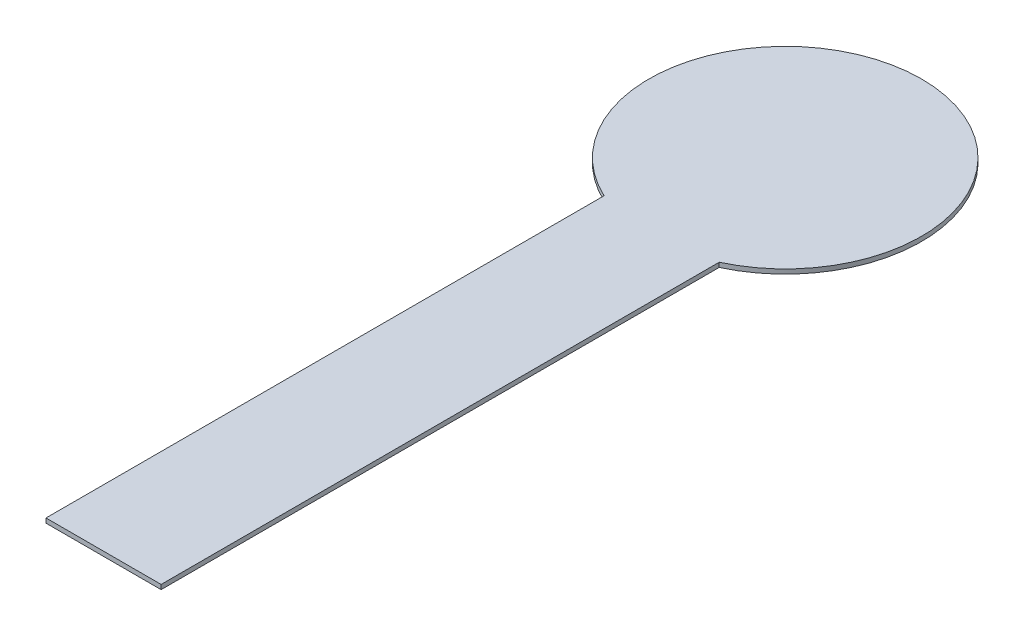
ISO-10303-21;
HEADER;
FILE_DESCRIPTION(('STEP AP214'),'2;1');
FILE_NAME('part.step','',(''),(''),'','','');
FILE_SCHEMA(('AUTOMOTIVE_DESIGN { 1 0 10303 214 1 1 1 1 }'));
ENDSEC;
DATA;
#1=APPLICATION_CONTEXT('core data for automotive mechanical design processes');
#2=APPLICATION_PROTOCOL_DEFINITION('international standard','automotive_design',2000,#1);
#3=PRODUCT_CONTEXT('',#1,'mechanical');
#4=PRODUCT('Part','Part','',(#3));
#5=PRODUCT_RELATED_PRODUCT_CATEGORY('part','',(#4));
#6=PRODUCT_DEFINITION_FORMATION('','',#4);
#7=PRODUCT_DEFINITION_CONTEXT('part definition',#1,'design');
#8=PRODUCT_DEFINITION('design','',#6,#7);
#9=PRODUCT_DEFINITION_SHAPE('','',#8);
#10=(LENGTH_UNIT() NAMED_UNIT(*) SI_UNIT(.MILLI.,.METRE.));
#11=(NAMED_UNIT(*) PLANE_ANGLE_UNIT() SI_UNIT($,.RADIAN.));
#12=(NAMED_UNIT(*) SI_UNIT($,.STERADIAN.) SOLID_ANGLE_UNIT());
#13=UNCERTAINTY_MEASURE_WITH_UNIT(LENGTH_MEASURE(1.E-05),#10,'distance_accuracy_value','');
#14=(GEOMETRIC_REPRESENTATION_CONTEXT(3) GLOBAL_UNCERTAINTY_ASSIGNED_CONTEXT((#13)) GLOBAL_UNIT_ASSIGNED_CONTEXT((#10,
#11,#12)) REPRESENTATION_CONTEXT('',''));
#15=CARTESIAN_POINT('',(0.,0.,0.));
#16=DIRECTION('',(0.,0.,1.));
#17=DIRECTION('',(1.,0.,0.));
#18=AXIS2_PLACEMENT_3D('',#15,#16,#17);
#19=CARTESIAN_POINT('',(3.8,-0.3,8.15843122174845));
#20=DIRECTION('',(-1.,0.,0.));
#21=DIRECTION('',(0.,0.,1.));
#22=AXIS2_PLACEMENT_3D('',#19,#20,#21);
#23=PLANE('',#22);
#24=DIRECTION('',(0.,0.,1.));
#25=VECTOR('',#24,1.);
#26=CARTESIAN_POINT('',(3.8,0.,8.15843122174845));
#27=LINE('',#26,#25);
#28=CARTESIAN_POINT('',(3.8,0.,8.15843122174845));
#29=VERTEX_POINT('',#28);
#30=CARTESIAN_POINT('',(3.8,0.,45.));
#31=VERTEX_POINT('',#30);
#32=EDGE_CURVE('E115',#29,#31,#27,.T.);
#33=ORIENTED_EDGE('',*,*,#32,.T.);
#34=DIRECTION('',(0.,1.,0.));
#35=VECTOR('',#34,1.);
#36=CARTESIAN_POINT('',(3.8,-0.3,45.));
#37=LINE('',#36,#35);
#38=CARTESIAN_POINT('',(3.8,-0.3,45.));
#39=VERTEX_POINT('',#38);
#40=EDGE_CURVE('E11',#39,#31,#37,.T.);
#41=ORIENTED_EDGE('',*,*,#40,.F.);
#42=DIRECTION('',(0.,0.,1.));
#43=VECTOR('',#42,1.);
#44=CARTESIAN_POINT('',(3.8,-0.3,8.15843122174845));
#45=LINE('',#44,#43);
#46=CARTESIAN_POINT('',(3.8,-0.3,8.15843122174845));
#47=VERTEX_POINT('',#46);
#48=EDGE_CURVE('E88',#47,#39,#45,.T.);
#49=ORIENTED_EDGE('',*,*,#48,.F.);
#50=DIRECTION('',(0.,1.,0.));
#51=VECTOR('',#50,1.);
#52=CARTESIAN_POINT('',(3.8,-0.3,8.15843122174845));
#53=LINE('',#52,#51);
#54=EDGE_CURVE('E64',#47,#29,#53,.T.);
#55=ORIENTED_EDGE('',*,*,#54,.T.);
#56=EDGE_LOOP('',(#33,#41,#49,#55));
#57=FACE_BOUND('',#56,.T.);
#58=ADVANCED_FACE('F47',(#57),#23,.F.);
#59=CARTESIAN_POINT('',(-3.8,-0.3,45.));
#60=DIRECTION('',(0.,0.,1.));
#61=DIRECTION('',(1.,0.,0.));
#62=AXIS2_PLACEMENT_3D('',#59,#60,#61);
#63=PLANE('',#62);
#64=DIRECTION('',(1.,0.,0.));
#65=VECTOR('',#64,1.);
#66=CARTESIAN_POINT('',(-3.8,0.,45.));
#67=LINE('',#66,#65);
#68=CARTESIAN_POINT('',(-3.8,0.,45.));
#69=VERTEX_POINT('',#68);
#70=EDGE_CURVE('E97',#69,#31,#67,.T.);
#71=ORIENTED_EDGE('',*,*,#70,.F.);
#72=DIRECTION('',(0.,1.,0.));
#73=VECTOR('',#72,1.);
#74=CARTESIAN_POINT('',(-3.8,-0.3,45.));
#75=LINE('',#74,#73);
#76=CARTESIAN_POINT('',(-3.8,-0.3,45.));
#77=VERTEX_POINT('',#76);
#78=EDGE_CURVE('E56',#77,#69,#75,.T.);
#79=ORIENTED_EDGE('',*,*,#78,.F.);
#80=DIRECTION('',(1.,0.,0.));
#81=VECTOR('',#80,1.);
#82=CARTESIAN_POINT('',(-3.8,-0.3,45.));
#83=LINE('',#82,#81);
#84=EDGE_CURVE('E95',#77,#39,#83,.T.);
#85=ORIENTED_EDGE('',*,*,#84,.T.);
#86=ORIENTED_EDGE('',*,*,#40,.T.);
#87=EDGE_LOOP('',(#71,#79,#85,#86));
#88=FACE_BOUND('',#87,.T.);
#89=ADVANCED_FACE('F94',(#88),#63,.T.);
#90=CARTESIAN_POINT('',(-3.8,-0.3,8.15843122174845));
#91=DIRECTION('',(-1.,0.,0.));
#92=DIRECTION('',(0.,0.,1.));
#93=AXIS2_PLACEMENT_3D('',#90,#91,#92);
#94=PLANE('',#93);
#95=DIRECTION('',(0.,0.,1.));
#96=VECTOR('',#95,1.);
#97=CARTESIAN_POINT('',(-3.8,0.,8.15843122174845));
#98=LINE('',#97,#96);
#99=CARTESIAN_POINT('',(-3.80000000000001,0.,8.15843122174845));
#100=VERTEX_POINT('',#99);
#101=EDGE_CURVE('E120',#100,#69,#98,.T.);
#102=ORIENTED_EDGE('',*,*,#101,.F.);
#103=DIRECTION('',(0.,1.,0.));
#104=VECTOR('',#103,1.);
#105=CARTESIAN_POINT('',(-3.80000000000001,-0.3,8.15843122174845));
#106=LINE('',#105,#104);
#107=CARTESIAN_POINT('',(-3.80000000000001,-0.3,8.15843122174845));
#108=VERTEX_POINT('',#107);
#109=EDGE_CURVE('E77',#108,#100,#106,.T.);
#110=ORIENTED_EDGE('',*,*,#109,.F.);
#111=DIRECTION('',(0.,0.,1.));
#112=VECTOR('',#111,1.);
#113=CARTESIAN_POINT('',(-3.8,-0.3,8.15843122174845));
#114=LINE('',#113,#112);
#115=EDGE_CURVE('E104',#108,#77,#114,.T.);
#116=ORIENTED_EDGE('',*,*,#115,.T.);
#117=ORIENTED_EDGE('',*,*,#78,.T.);
#118=EDGE_LOOP('',(#102,#110,#116,#117));
#119=FACE_BOUND('',#118,.T.);
#120=ADVANCED_FACE('F107',(#119),#94,.T.);
#121=CARTESIAN_POINT('',(0.,-0.3,0.));
#122=DIRECTION('',(0.,1.,0.));
#123=DIRECTION('',(0.,0.,1.));
#124=AXIS2_PLACEMENT_3D('',#121,#122,#123);
#125=CYLINDRICAL_SURFACE('',#124,9.);
#126=CARTESIAN_POINT('',(0.,0.,0.));
#127=DIRECTION('',(0.,1.,0.));
#128=DIRECTION('',(0.,0.,1.));
#129=AXIS2_PLACEMENT_3D('',#126,#127,#128);
#130=CIRCLE('',#129,9.);
#131=EDGE_CURVE('E123',#29,#100,#130,.T.);
#132=ORIENTED_EDGE('',*,*,#131,.F.);
#133=ORIENTED_EDGE('',*,*,#54,.F.);
#134=CARTESIAN_POINT('',(0.,-0.3,0.));
#135=DIRECTION('',(0.,1.,0.));
#136=DIRECTION('',(0.,0.,1.));
#137=AXIS2_PLACEMENT_3D('',#134,#135,#136);
#138=CIRCLE('',#137,9.);
#139=EDGE_CURVE('E109',#47,#108,#138,.T.);
#140=ORIENTED_EDGE('',*,*,#139,.T.);
#141=ORIENTED_EDGE('',*,*,#109,.T.);
#142=EDGE_LOOP('',(#132,#133,#140,#141));
#143=FACE_BOUND('',#142,.T.);
#144=ADVANCED_FACE('F133',(#143),#125,.T.);
#145=CARTESIAN_POINT('',(0.,-0.3,0.));
#146=DIRECTION('',(0.,1.,0.));
#147=DIRECTION('',(0.,0.,1.));
#148=AXIS2_PLACEMENT_3D('',#145,#146,#147);
#149=PLANE('',#148);
#150=ORIENTED_EDGE('',*,*,#48,.T.);
#151=ORIENTED_EDGE('',*,*,#84,.F.);
#152=ORIENTED_EDGE('',*,*,#115,.F.);
#153=ORIENTED_EDGE('',*,*,#139,.F.);
#154=EDGE_LOOP('',(#150,#151,#152,#153));
#155=FACE_BOUND('',#154,.T.);
#156=ADVANCED_FACE('F103',(#155),#149,.F.);
#157=CARTESIAN_POINT('',(0.,0.,0.));
#158=DIRECTION('',(0.,1.,0.));
#159=DIRECTION('',(0.,0.,1.));
#160=AXIS2_PLACEMENT_3D('',#157,#158,#159);
#161=PLANE('',#160);
#162=ORIENTED_EDGE('',*,*,#32,.F.);
#163=ORIENTED_EDGE('',*,*,#131,.T.);
#164=ORIENTED_EDGE('',*,*,#101,.T.);
#165=ORIENTED_EDGE('',*,*,#70,.T.);
#166=EDGE_LOOP('',(#162,#163,#164,#165));
#167=FACE_BOUND('',#166,.T.);
#168=ADVANCED_FACE('F132',(#167),#161,.T.);
#169=CLOSED_SHELL('',(#58,#89,#120,#144,#156,#168));
#170=MANIFOLD_SOLID_BREP('B2',#169);
#171=ADVANCED_BREP_SHAPE_REPRESENTATION('',(#18,#170),#14);
#172=SHAPE_DEFINITION_REPRESENTATION(#9,#171);
ENDSEC;
END-ISO-10303-21;
